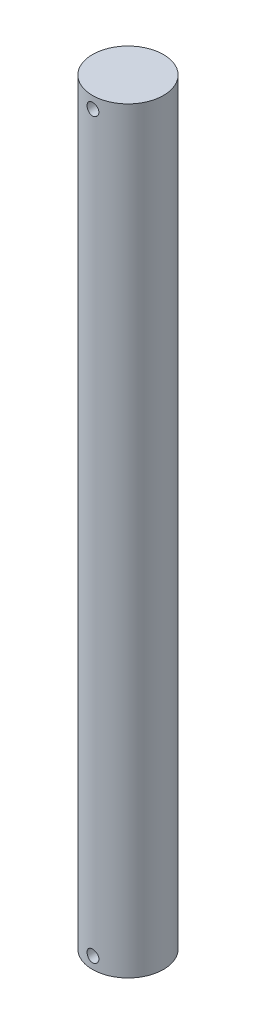
ISO-10303-21;
HEADER;
FILE_DESCRIPTION(('STEP AP214'),'2;1');
FILE_NAME('part.step','',(''),(''),'','','');
FILE_SCHEMA(('AUTOMOTIVE_DESIGN { 1 0 10303 214 1 1 1 1 }'));
ENDSEC;
DATA;
#1=APPLICATION_CONTEXT('core data for automotive mechanical design processes');
#2=APPLICATION_PROTOCOL_DEFINITION('international standard','automotive_design',2000,#1);
#3=PRODUCT_CONTEXT('',#1,'mechanical');
#4=PRODUCT('Part','Part','',(#3));
#5=PRODUCT_RELATED_PRODUCT_CATEGORY('part','',(#4));
#6=PRODUCT_DEFINITION_FORMATION('','',#4);
#7=PRODUCT_DEFINITION_CONTEXT('part definition',#1,'design');
#8=PRODUCT_DEFINITION('design','',#6,#7);
#9=PRODUCT_DEFINITION_SHAPE('','',#8);
#10=(LENGTH_UNIT() NAMED_UNIT(*) SI_UNIT(.MILLI.,.METRE.));
#11=(NAMED_UNIT(*) PLANE_ANGLE_UNIT() SI_UNIT($,.RADIAN.));
#12=(NAMED_UNIT(*) SI_UNIT($,.STERADIAN.) SOLID_ANGLE_UNIT());
#13=UNCERTAINTY_MEASURE_WITH_UNIT(LENGTH_MEASURE(1.E-05),#10,'distance_accuracy_value','');
#14=(GEOMETRIC_REPRESENTATION_CONTEXT(3) GLOBAL_UNCERTAINTY_ASSIGNED_CONTEXT((#13)) GLOBAL_UNIT_ASSIGNED_CONTEXT((#10,
#11,#12)) REPRESENTATION_CONTEXT('',''));
#15=CARTESIAN_POINT('',(0.,0.,0.));
#16=DIRECTION('',(0.,0.,1.));
#17=DIRECTION('',(1.,0.,0.));
#18=AXIS2_PLACEMENT_3D('',#15,#16,#17);
#19=CARTESIAN_POINT('',(0.,640.,0.));
#20=DIRECTION('',(0.,-1.,0.));
#21=DIRECTION('',(0.,0.,-1.));
#22=AXIS2_PLACEMENT_3D('',#19,#20,#21);
#23=CYLINDRICAL_SURFACE('',#22,30.);
#24=CARTESIAN_POINT('',(0.,15.,-30.));
#25=CARTESIAN_POINT('',(-0.139438730306518,15.000002148603,-30.0000009341092));
#26=CARTESIAN_POINT('',(-0.27884837499536,14.9941652443515,-29.9990260400444));
#27=CARTESIAN_POINT('',(-0.556708896140972,14.9708658164974,-29.9951557115238));
#28=CARTESIAN_POINT('',(-0.695159577308831,14.9534009913958,-29.9922598968632));
#29=CARTESIAN_POINT('',(-0.970150520344154,14.9069611871019,-29.9846251699259));
#30=CARTESIAN_POINT('',(-1.10668952072418,14.8779789470685,-29.979885095025));
#31=CARTESIAN_POINT('',(-1.37685247096437,14.8087139445941,-29.9686930297133));
#32=CARTESIAN_POINT('',(-1.51047533178691,14.7684270356836,-29.9622404112013));
#33=CARTESIAN_POINT('',(-1.77365528085701,14.6769149986391,-29.9478128865368));
#34=CARTESIAN_POINT('',(-1.90321704710935,14.6257030293222,-29.9398398129292));
#35=CARTESIAN_POINT('',(-2.15759207174616,14.512668231626,-29.9225843720656));
#36=CARTESIAN_POINT('',(-2.28240355940393,14.4508414928787,-29.9133015225275));
#37=CARTESIAN_POINT('',(-2.52631223217171,14.3170688876175,-29.8936901460056));
#38=CARTESIAN_POINT('',(-2.64541222152925,14.2451280566014,-29.8833621400859));
#39=CARTESIAN_POINT('',(-2.87720075943645,14.0915826775771,-29.8619368035706));
#40=CARTESIAN_POINT('',(-2.98988690101178,14.0099745365835,-29.8508391875783));
#41=CARTESIAN_POINT('',(-3.20893550320275,13.8369740483396,-29.8280901061561));
#42=CARTESIAN_POINT('',(-3.3152386019937,13.7455070296461,-29.8164348485225));
#43=CARTESIAN_POINT('',(-3.51981905081325,13.5539441062719,-29.792977049997));
#44=CARTESIAN_POINT('',(-3.6180934149484,13.4538450195095,-29.7811744561748));
#45=CARTESIAN_POINT('',(-3.80586900468401,13.2457655657288,-29.757760553176));
#46=CARTESIAN_POINT('',(-3.89537288715651,13.137787602886,-29.7461491869625));
#47=CARTESIAN_POINT('',(-4.06505128766863,12.9146207574097,-29.7234367117224));
#48=CARTESIAN_POINT('',(-4.14522235269035,12.7994292299429,-29.7123357924676));
#49=CARTESIAN_POINT('',(-4.29606801839333,12.5619714746938,-29.6909016370194));
#50=CARTESIAN_POINT('',(-4.36668480543058,12.4396680682227,-29.6805732300208));
#51=CARTESIAN_POINT('',(-4.49737903615683,12.1894109133508,-29.6610510502017));
#52=CARTESIAN_POINT('',(-4.55745254274493,12.0614550764348,-29.6518577016161));
#53=CARTESIAN_POINT('',(-4.66655756396113,11.800880688985,-29.6348831234285));
#54=CARTESIAN_POINT('',(-4.7155937427807,11.6682641354876,-29.6271012976113));
#55=CARTESIAN_POINT('',(-4.80229722760728,11.399267690265,-29.6131700678879));
#56=CARTESIAN_POINT('',(-4.83996038282925,11.2628864443209,-29.6070212600786));
#57=CARTESIAN_POINT('',(-4.93477467758659,10.8521985241443,-29.5914227981395));
#58=CARTESIAN_POINT('',(-4.97488357358493,10.5736311346302,-29.5846386003063));
#59=CARTESIAN_POINT('',(-5.00784793424048,10.0137968416156,-29.5790755483693));
#60=CARTESIAN_POINT('',(-5.00070674304215,9.73253013056755,-29.5802961277241));
#61=CARTESIAN_POINT('',(-4.93978637434362,9.17815552142718,-29.590529429811));
#62=CARTESIAN_POINT('',(-4.88648873937526,8.90499340626046,-29.5994616948564));
#63=CARTESIAN_POINT('',(-4.73550730524632,8.37155435088744,-29.6239896757343));
#64=CARTESIAN_POINT('',(-4.63782198375658,8.11127785294845,-29.6395856201047));
#65=CARTESIAN_POINT('',(-4.40035421574883,7.60954316628105,-29.6757696483376));
#66=CARTESIAN_POINT('',(-4.26037175365461,7.36818140582108,-29.6963813586744));
#67=CARTESIAN_POINT('',(-3.94242410922568,6.91219098092208,-29.7402583517709));
#68=CARTESIAN_POINT('',(-3.76445586128014,6.69756447634457,-29.7635238486315));
#69=CARTESIAN_POINT('',(-3.37296440409906,6.29834788785884,-29.8104405621052));
#70=CARTESIAN_POINT('',(-3.15902792232791,6.1141629788504,-29.8340929858411));
#71=CARTESIAN_POINT('',(-2.70307050338167,5.78424445873864,-29.8788520267263));
#72=CARTESIAN_POINT('',(-2.46104938526711,5.63851109538495,-29.8999586274719));
#73=CARTESIAN_POINT('',(-1.95541183087794,5.38959554997958,-29.9372778581815));
#74=CARTESIAN_POINT('',(-1.6917774507324,5.2864491623958,-29.9534863682324));
#75=CARTESIAN_POINT('',(-1.15059669160235,5.1260115684498,-29.9791500601698));
#76=CARTESIAN_POINT('',(-0.873051478491172,5.06871652607123,-29.988605806999));
#77=CARTESIAN_POINT('',(-0.315419802472563,5.00215728305926,-29.999622596864));
#78=CARTESIAN_POINT('',(-0.0354014741699759,4.99233685528185,-30.0012750602153));
#79=CARTESIAN_POINT('',(0.522279545647737,5.01952268996312,-29.9967494884638));
#80=CARTESIAN_POINT('',(0.799942327386603,5.05652715067645,-29.9905717546544));
#81=CARTESIAN_POINT('',(1.3433123514886,5.17584969428862,-29.971136538593));
#82=CARTESIAN_POINT('',(1.60908173821583,5.25789240039748,-29.9579220953842));
#83=CARTESIAN_POINT('',(2.12309376827574,5.46466905278275,-29.9258892897492));
#84=CARTESIAN_POINT('',(2.37133542643381,5.5894053964243,-29.9070706126377));
#85=CARTESIAN_POINT('',(2.84566138437114,5.87930218769945,-29.8656903236297));
#86=CARTESIAN_POINT('',(3.07153052223238,6.04481008114228,-29.8430971086773));
#87=CARTESIAN_POINT('',(3.49248715064582,6.41107486197913,-29.7967693569018));
#88=CARTESIAN_POINT('',(3.68757240338597,6.61183430971993,-29.7730347372687));
#89=CARTESIAN_POINT('',(4.04348563611056,7.04539422403469,-29.7268034705286));
#90=CARTESIAN_POINT('',(4.20393781021313,7.27850506055188,-29.7043221945332));
#91=CARTESIAN_POINT('',(4.48340433261341,7.76870920865032,-29.6634307237625));
#92=CARTESIAN_POINT('',(4.60241999444133,8.02580175968778,-29.6450203999454));
#93=CARTESIAN_POINT('',(4.79507773356379,8.55556730727753,-29.6144685973239));
#94=CARTESIAN_POINT('',(4.86890685306042,8.82817090119132,-29.602301310812));
#95=CARTESIAN_POINT('',(4.96966691993878,9.38228554337532,-29.5855561119601));
#96=CARTESIAN_POINT('',(4.99660194454599,9.66379581508378,-29.580977539818));
#97=CARTESIAN_POINT('',(5.0012321244509,10.0844097834175,-29.5801885462874));
#98=CARTESIAN_POINT('',(4.99693975789018,10.2235369220243,-29.5809172344068));
#99=CARTESIAN_POINT('',(4.97678436801742,10.5009125844857,-29.5843160283654));
#100=CARTESIAN_POINT('',(4.96092569221815,10.6391614187853,-29.5869854047428));
#101=CARTESIAN_POINT('',(4.91774640529922,10.9138477892768,-29.5941926651669));
#102=CARTESIAN_POINT('',(4.89042170080803,11.0502846606349,-29.5987312164982));
#103=CARTESIAN_POINT('',(4.82453301754958,11.3202964548754,-29.6095423170401));
#104=CARTESIAN_POINT('',(4.78597308458851,11.4538723894262,-29.615814242021));
#105=CARTESIAN_POINT('',(4.6979342864003,11.7171686051217,-29.6299071307843));
#106=CARTESIAN_POINT('',(4.64846435664851,11.846891943521,-29.6377268263817));
#107=CARTESIAN_POINT('',(4.53896986674982,12.1016587264378,-29.6546930297384));
#108=CARTESIAN_POINT('',(4.47894908739059,12.226703827951,-29.6638390620139));
#109=CARTESIAN_POINT('',(4.34874498523013,12.4713614507995,-29.6832065043881));
#110=CARTESIAN_POINT('',(4.27855767862003,12.5909718182554,-29.6934283356131));
#111=CARTESIAN_POINT('',(4.12855715704193,12.8238615256318,-29.7146554589665));
#112=CARTESIAN_POINT('',(4.04874732556529,12.9371430705211,-29.7256604751555));
#113=CARTESIAN_POINT('',(3.87899685367998,13.1580086987021,-29.7482907408856));
#114=CARTESIAN_POINT('',(3.78894418512202,13.2655060901041,-29.7599219326499));
#115=CARTESIAN_POINT('',(3.60017574898997,13.472513396479,-29.783347263822));
#116=CARTESIAN_POINT('',(3.50146308651917,13.5720261500963,-29.7951413435574));
#117=CARTESIAN_POINT('',(3.29596225179814,13.7624819299774,-29.8185735949796));
#118=CARTESIAN_POINT('',(3.18916929766622,13.8534198090311,-29.8302116694714));
#119=CARTESIAN_POINT('',(2.9683310868055,14.0259957161049,-29.8529952569281));
#120=CARTESIAN_POINT('',(2.85428852146921,14.1076371643346,-29.8641409501131));
#121=CARTESIAN_POINT('',(2.6188382428721,14.2616450304106,-29.8857116363867));
#122=CARTESIAN_POINT('',(2.49738284629917,14.3339393989323,-29.896130775176));
#123=CARTESIAN_POINT('',(2.24876507402075,14.4679967471859,-29.9158586577262));
#124=CARTESIAN_POINT('',(2.12160481976541,14.5297636014166,-29.925167809621));
#125=CARTESIAN_POINT('',(1.86251821435405,14.6423007062681,-29.9424090895346));
#126=CARTESIAN_POINT('',(1.7305952461548,14.6930785897747,-29.950342172599));
#127=CARTESIAN_POINT('',(1.46288984328885,14.7832948188954,-29.9646113279921));
#128=CARTESIAN_POINT('',(1.32710824358209,14.8227355974939,-29.9709477429356));
#129=CARTESIAN_POINT('',(0.99549214137986,14.9039783011701,-29.9841083147641));
#130=CARTESIAN_POINT('',(0.798161887183512,14.9399436570318,-29.9900398634941));
#131=CARTESIAN_POINT('',(0.400534394814459,14.9879527577987,-29.9979850016837));
#132=CARTESIAN_POINT('',(0.20023720778345,14.9999969145569,-29.9999986585978));
#133=CARTESIAN_POINT('',(0.,15.,-30.));
#134=B_SPLINE_CURVE_WITH_KNOTS('',3,(#24,#25,#26,#27,#28,#29,#30,#31,#32,#33,#34,#35,#36,#37,
#38,#39,#40,#41,#42,#43,#44,#45,#46,#47,#48,#49,#50,#51,#52,#53,#54,#55,#56,#57,#58,#59,#60,#61,
#62,#63,#64,#65,#66,#67,#68,#69,#70,#71,#72,#73,#74,#75,#76,#77,#78,#79,#80,#81,#82,#83,#84,#85,
#86,#87,#88,#89,#90,#91,#92,#93,#94,#95,#96,#97,#98,#99,#100,#101,#102,#103,#104,#105,#106,#107,
#108,#109,#110,#111,#112,#113,#114,#115,#116,#117,#118,#119,#120,#121,#122,#123,#124,#125,#126,
#127,#128,#129,#130,#131,#132,#133),.UNSPECIFIED.,.T.,.F.,(4,2,2,2,2,2,2,2,2,2,2,2,2,2,2,2,2,2,
2,2,2,2,2,2,2,2,2,2,2,2,2,2,2,2,2,2,2,2,2,2,2,2,2,2,2,2,2,2,2,2,2,2,2,2,4),(0.,
0.418140677636318,0.836364141924731,1.25485168316257,1.67349292366114,2.09163274536574,
2.50992693714591,2.92801360569262,3.3462561521736,3.767924736377,4.18974943231197,
4.61144594582073,5.03329798883921,5.45759827861687,5.88205667621393,6.30633536657102,
6.73076871826474,7.57090272280959,8.41097726715885,9.24239161594929,10.0738344812487,
10.9092723133923,11.7447775943526,12.5906365789677,13.4365010134581,14.2830749590592,
15.1295780711641,15.9661388505691,16.8026674414583,17.6341373208694,18.4656538972625,
19.3045176932816,20.1434424418268,20.9910576208935,21.83864592826,22.6827016275766,
23.5266839364735,23.9438629667131,24.3608852695982,24.77805657625,25.1950778447662,
25.6117588257789,26.0282907967259,26.4449864317718,26.8615359724481,27.2831832626947,
27.7046799813852,28.1264281209232,28.5480205921467,28.9726903230862,29.3972034214198,
29.8214207018257,30.2455468755532,30.8460167962321,31.4464763784911),.UNSPECIFIED.);
#135=CARTESIAN_POINT('',(0.,15.,-30.));
#136=VERTEX_POINT('',#135);
#137=EDGE_CURVE('E10',#136,#136,#134,.T.);
#138=ORIENTED_EDGE('',*,*,#137,.T.);
#139=EDGE_LOOP('',(#138));
#140=FACE_BOUND('',#139,.T.);
#141=CARTESIAN_POINT('',(5.,9.99999999999999,29.5803989154981));
#142=CARTESIAN_POINT('',(5.00000215212787,9.86057639626243,29.5803979326159));
#143=CARTESIAN_POINT('',(4.99416650120511,9.72118188035827,29.5813865662228));
#144=CARTESIAN_POINT('',(4.97087220441201,9.44335202662435,29.5853101778166));
#145=CARTESIAN_POINT('',(4.95341125568433,9.30491688432795,29.5882455414312));
#146=CARTESIAN_POINT('',(4.90698205316678,9.02995735248328,29.595980767529));
#147=CARTESIAN_POINT('',(4.87800651661557,8.89343422893418,29.6007818099767));
#148=CARTESIAN_POINT('',(4.80875805511328,8.62330337377943,29.6121103008977));
#149=CARTESIAN_POINT('',(4.76848098179349,8.48969673215014,29.618638383252));
#150=CARTESIAN_POINT('',(4.67699269476572,8.22655128993244,29.6332225751521));
#151=CARTESIAN_POINT('',(4.62579483693731,8.09700774026884,29.6412768169069));
#152=CARTESIAN_POINT('',(4.51279168660919,7.8426675985294,29.6586914491271));
#153=CARTESIAN_POINT('',(4.45098248431024,7.71787277692327,29.6680523207879));
#154=CARTESIAN_POINT('',(4.3172476442902,7.47399448609597,29.6878078821124));
#155=CARTESIAN_POINT('',(4.24532702372849,7.35490822341934,29.6982020583187));
#156=CARTESIAN_POINT('',(4.09182393832117,7.1231434031446,29.7197406344104));
#157=CARTESIAN_POINT('',(4.01023788081428,7.01046725137721,29.7308853125904));
#158=CARTESIAN_POINT('',(3.83725956163011,6.79140518707714,29.7537075193766));
#159=CARTESIAN_POINT('',(3.74579019488665,6.68508053864487,29.765388757594));
#160=CARTESIAN_POINT('',(3.55421801378063,6.48045677901976,29.7888712088753));
#161=CARTESIAN_POINT('',(3.45411201537784,6.38216065390049,29.8006724647591));
#162=CARTESIAN_POINT('',(3.2460144077782,6.19434246688342,29.8240565154478));
#163=CARTESIAN_POINT('',(3.13802523187875,6.1048177173451,29.8356393762872));
#164=CARTESIAN_POINT('',(2.91483167477465,5.9350991630834,29.8582708932577));
#165=CARTESIAN_POINT('',(2.79962464827634,5.85490881049046,29.8693193508737));
#166=CARTESIAN_POINT('',(2.56215441101307,5.7040411409087,29.8906281533999));
#167=CARTESIAN_POINT('',(2.43985519869266,5.6334197920083,29.9008837226048));
#168=CARTESIAN_POINT('',(2.18960603977585,5.50271600286675,29.9202504077895));
#169=CARTESIAN_POINT('',(2.06165400465136,5.44263749931004,29.9293610959132));
#170=CARTESIAN_POINT('',(1.80108735309577,5.33352223665116,29.9461700436224));
#171=CARTESIAN_POINT('',(1.6684747236184,5.28448083656165,29.9538688966168));
#172=CARTESIAN_POINT('',(1.39948700260422,5.19776675687594,29.9676431912186));
#173=CARTESIAN_POINT('',(1.26311055653696,5.16009822997123,29.9737180397443));
#174=CARTESIAN_POINT('',(0.852446509264918,5.0652690310551,29.9891228124451));
#175=CARTESIAN_POINT('',(0.573900376996178,5.02514865906307,29.9958138795881));
#176=CARTESIAN_POINT('',(0.0141079703099225,4.99215400160735,30.0013047692693));
#177=CARTESIAN_POINT('',(-0.267138119279395,4.99927650479383,30.000105128181));
#178=CARTESIAN_POINT('',(-0.821593120474354,5.06016652948971,29.9900163282399));
#179=CARTESIAN_POINT('',(-1.09485404654849,5.11347135228088,29.9812034486287));
#180=CARTESIAN_POINT('',(-1.6284869741672,5.26450112299916,29.9569598006588));
#181=CARTESIAN_POINT('',(-1.88885858289245,5.36222742380764,29.9415288307432));
#182=CARTESIAN_POINT('',(-2.39071148226925,5.59978155726274,29.9056539094833));
#183=CARTESIAN_POINT('',(-2.63210082802069,5.73980009832084,29.885187330251));
#184=CARTESIAN_POINT('',(-3.08813127772834,6.05782557110812,29.8415147777179));
#185=CARTESIAN_POINT('',(-3.30277021457954,6.23583557743863,29.8183085827714));
#186=CARTESIAN_POINT('',(-3.70194248743282,6.62735763346403,29.77140536021));
#187=CARTESIAN_POINT('',(-3.88607898857917,6.84127419522207,29.7477057934308));
#188=CARTESIAN_POINT('',(-4.21590919282353,7.29717417501147,29.7027591968862));
#189=CARTESIAN_POINT('',(-4.36160254131311,7.5391578519107,29.6815121897447));
#190=CARTESIAN_POINT('',(-4.61048886472354,8.04478328521151,29.6438750909177));
#191=CARTESIAN_POINT('',(-4.71363405349992,8.30844899658137,29.6274904659697));
#192=CARTESIAN_POINT('',(-4.87405974268971,8.84969814421793,29.6015237738799));
#193=CARTESIAN_POINT('',(-4.93134428151734,9.12728035273259,29.5919411077771));
#194=CARTESIAN_POINT('',(-4.99786376977689,9.68493231245493,29.5807791884317));
#195=CARTESIAN_POINT('',(-5.0076644169312,9.96493275953604,29.5791057152116));
#196=CARTESIAN_POINT('',(-4.98044540425865,10.5225733432498,29.583700695609));
#197=CARTESIAN_POINT('',(-4.94342755284268,10.8002135706313,29.5899688424735));
#198=CARTESIAN_POINT('',(-4.82410467423498,11.3434555187759,29.6096537492629));
#199=CARTESIAN_POINT('',(-4.74208759766018,11.6091222811975,29.6230250389774));
#200=CARTESIAN_POINT('',(-4.53539636401618,12.1229403311174,29.6553714594995));
#201=CARTESIAN_POINT('',(-4.4107196551057,12.3710905697294,29.6743469255321));
#202=CARTESIAN_POINT('',(-4.12091340811815,12.8453491942341,29.7159825702484));
#203=CARTESIAN_POINT('',(-3.95542135942323,13.0712331658314,29.7386751206295));
#204=CARTESIAN_POINT('',(-3.5891787002952,13.4922270450693,29.7850933249741));
#205=CARTESIAN_POINT('',(-3.38842560992089,13.6873347863563,29.8088190515135));
#206=CARTESIAN_POINT('',(-2.95485701247824,14.0433038621095,29.8549284748932));
#207=CARTESIAN_POINT('',(-2.72172977623535,14.2037879400263,29.8772956488783));
#208=CARTESIAN_POINT('',(-2.23148362654147,14.4833103665618,29.9179021266779));
#209=CARTESIAN_POINT('',(-1.97436548948827,14.6023500558218,29.9361415640095));
#210=CARTESIAN_POINT('',(-1.44461025477472,14.7950222363159,29.9663676167788));
#211=CARTESIAN_POINT('',(-1.17204638474136,14.8688521307716,29.9783813800026));
#212=CARTESIAN_POINT('',(-0.618016213936816,14.9696272189533,29.9949099748744));
#213=CARTESIAN_POINT('',(-0.336550647617407,14.9965762704526,29.999425423549));
#214=CARTESIAN_POINT('',(0.084051323623507,15.001239001663,30.0002084581204));
#215=CARTESIAN_POINT('',(0.223209655690205,14.9969552500374,29.999491569583));
#216=CARTESIAN_POINT('',(0.500648669793316,14.9768117991662,29.9961418479859));
#217=CARTESIAN_POINT('',(0.638929661828227,14.9609564482256,29.9935097346187));
#218=CARTESIAN_POINT('',(0.913680965571359,14.9177783012345,29.9863985702464));
#219=CARTESIAN_POINT('',(1.05015061623528,14.8904514312823,29.9819188631118));
#220=CARTESIAN_POINT('',(1.32022824391753,14.824552637904,29.9712403869649));
#221=CARTESIAN_POINT('',(1.45383723354143,14.7859847666036,29.9650422374513));
#222=CARTESIAN_POINT('',(1.71720548972901,14.6979220262972,29.95110323313));
#223=CARTESIAN_POINT('',(1.84696762706274,14.6484355508395,29.9433635637899));
#224=CARTESIAN_POINT('',(2.10180951631926,14.5389013361162,29.9265550855046));
#225=CARTESIAN_POINT('',(2.22689092747563,14.4788573831337,29.9174867532583));
#226=CARTESIAN_POINT('',(2.47161697545382,14.3486011123381,29.8982638774694));
#227=CARTESIAN_POINT('',(2.59125946645759,14.2783848261974,29.8881089104256));
#228=CARTESIAN_POINT('',(2.8242079991635,14.1283215520988,29.8669972490416));
#229=CARTESIAN_POINT('',(2.93751624967617,14.048477952327,29.8560408372885));
#230=CARTESIAN_POINT('',(3.15838432816091,13.8786904463363,29.8334892153085));
#231=CARTESIAN_POINT('',(3.26586029407928,13.788638226688,29.8218879813952));
#232=CARTESIAN_POINT('',(3.47282432265109,13.5998751311197,29.7984955265668));
#233=CARTESIAN_POINT('',(3.57231522401815,13.5011673586216,29.7867043749739));
#234=CARTESIAN_POINT('',(3.76272784850023,13.2956806705058,29.7632506471209));
#235=CARTESIAN_POINT('',(3.85364439911056,13.1888969521477,29.7515881521716));
#236=CARTESIAN_POINT('',(4.02617893630593,12.9680815442526,29.7287311492829));
#237=CARTESIAN_POINT('',(4.10780033921658,12.8540525418,29.7175364703668));
#238=CARTESIAN_POINT('',(4.26178317336446,12.6186134362886,29.6958464681928));
#239=CARTESIAN_POINT('',(4.33407091155741,12.4971545774759,29.6853569910252));
#240=CARTESIAN_POINT('',(4.4681147095236,12.2485306516489,29.6654772768531));
#241=CARTESIAN_POINT('',(4.5298746441277,12.1213677059251,29.6560866358151));
#242=CARTESIAN_POINT('',(4.6423978626488,11.8622759875397,29.6386805621146));
#243=CARTESIAN_POINT('',(4.69316880713277,11.7303506101737,29.6306641722598));
#244=CARTESIAN_POINT('',(4.7833713057041,11.4626397573099,29.6162360630624));
#245=CARTESIAN_POINT('',(4.82280529766023,11.326855118609,29.6098239987682));
#246=CARTESIAN_POINT('',(4.90401989375999,10.9952779254209,29.596502515164));
#247=CARTESIAN_POINT('',(4.93996956730933,10.7979905965017,29.5904931161671));
#248=CARTESIAN_POINT('',(4.98795785830044,10.4004488187018,29.5824420579954));
#249=CARTESIAN_POINT('',(4.99999690982024,10.2001944237523,29.5804003267909));
#250=CARTESIAN_POINT('',(5.,9.99999999999999,29.5803989154981));
#251=B_SPLINE_CURVE_WITH_KNOTS('',3,(#141,#142,#143,#144,#145,#146,#147,#148,#149,#150,#151,
#152,#153,#154,#155,#156,#157,#158,#159,#160,#161,#162,#163,#164,#165,#166,#167,#168,#169,#170,
#171,#172,#173,#174,#175,#176,#177,#178,#179,#180,#181,#182,#183,#184,#185,#186,#187,#188,#189,
#190,#191,#192,#193,#194,#195,#196,#197,#198,#199,#200,#201,#202,#203,#204,#205,#206,#207,#208,
#209,#210,#211,#212,#213,#214,#215,#216,#217,#218,#219,#220,#221,#222,#223,#224,#225,#226,#227,
#228,#229,#230,#231,#232,#233,#234,#235,#236,#237,#238,#239,#240,#241,#242,#243,#244,#245,#246,
#247,#248,#249,#250),.UNSPECIFIED.,.T.,.F.,(4,2,2,2,2,2,2,2,2,2,2,2,2,2,2,2,2,2,2,2,2,2,2,2,2,2,
2,2,2,2,2,2,2,2,2,2,2,2,2,2,2,2,2,2,2,2,2,2,2,2,2,2,2,2,4),(0.,0.418095242549752,
0.836273330312913,1.25471632992755,1.67331312559436,2.09140089204124,2.50964303678586,
2.92767838265871,3.34586960348905,3.76759791918756,4.18948238202711,4.61123716813954,
5.03314743913425,5.45742771408346,5.88186607917447,6.30612563749769,6.730539923145,
7.57061257037404,8.41062811397658,9.24232364421611,10.0740445059134,10.9095733037112,
11.745169745458,12.5909036901652,13.4366454358431,14.2833344708948,15.1299489396843,
15.966452069331,16.8029228892023,17.6341025136326,18.4653318667942,19.3042280761768,
20.1431833095365,20.9908634816304,21.8385162304567,22.6824409092757,23.5262961391698,
23.9435677338949,24.3606826095272,24.7779457414127,25.1950586450546,25.6118520083923,
26.0284961987167,26.4453033659293,26.8619642700311,27.2835543146456,27.7049938127195,
28.1266859407461,28.5482225769884,28.9729067446496,29.3974342652835,29.8216648822648,
30.2458042054463,30.8461462814325,31.4464774585936),.UNSPECIFIED.);
#252=CARTESIAN_POINT('',(5.,9.99999999999999,29.5803989154981));
#253=VERTEX_POINT('',#252);
#254=EDGE_CURVE('E44',#253,#253,#251,.T.);
#255=ORIENTED_EDGE('',*,*,#254,.T.);
#256=EDGE_LOOP('',(#255));
#257=FACE_BOUND('',#256,.T.);
#258=CARTESIAN_POINT('',(0.,635.,-30.));
#259=CARTESIAN_POINT('',(-0.139438730306515,635.000002148603,-30.0000009341092));
#260=CARTESIAN_POINT('',(-0.278848374995354,634.994165244352,-29.9990260400444));
#261=CARTESIAN_POINT('',(-0.556708896140966,634.970865816498,-29.9951557115238));
#262=CARTESIAN_POINT('',(-0.695159577308828,634.953400991396,-29.9922598968632));
#263=CARTESIAN_POINT('',(-0.970150520344144,634.906961187102,-29.9846251699259));
#264=CARTESIAN_POINT('',(-1.10668952072416,634.877978947068,-29.979885095025));
#265=CARTESIAN_POINT('',(-1.37685247096436,634.808713944594,-29.9686930297133));
#266=CARTESIAN_POINT('',(-1.51047533178691,634.768427035684,-29.9622404112013));
#267=CARTESIAN_POINT('',(-1.77365528085701,634.676914998639,-29.9478128865369));
#268=CARTESIAN_POINT('',(-1.90321704710932,634.625703029322,-29.9398398129292));
#269=CARTESIAN_POINT('',(-2.15759207174612,634.512668231626,-29.9225843720657));
#270=CARTESIAN_POINT('',(-2.28240355940389,634.450841492879,-29.9133015225275));
#271=CARTESIAN_POINT('',(-2.52631223217169,634.317068887618,-29.8936901460056));
#272=CARTESIAN_POINT('',(-2.64541222152922,634.245128056602,-29.8833621400859));
#273=CARTESIAN_POINT('',(-2.87720075943642,634.091582677577,-29.8619368035706));
#274=CARTESIAN_POINT('',(-2.98988690101175,634.009974536584,-29.8508391875783));
#275=CARTESIAN_POINT('',(-3.20893550320274,633.83697404834,-29.8280901061561));
#276=CARTESIAN_POINT('',(-3.31523860199372,633.745507029646,-29.8164348485225));
#277=CARTESIAN_POINT('',(-3.51981905081328,633.553944106272,-29.792977049997));
#278=CARTESIAN_POINT('',(-3.61809341494841,633.45384501951,-29.7811744561748));
#279=CARTESIAN_POINT('',(-3.805869004684,633.245765565729,-29.757760553176));
#280=CARTESIAN_POINT('',(-3.89537288715651,633.137787602886,-29.7461491869625));
#281=CARTESIAN_POINT('',(-4.06505128766864,632.91462075741,-29.7234367117224));
#282=CARTESIAN_POINT('',(-4.14522235269037,632.799429229943,-29.7123357924676));
#283=CARTESIAN_POINT('',(-4.29606801839331,632.561971474694,-29.6909016370194));
#284=CARTESIAN_POINT('',(-4.36668480543054,632.439668068223,-29.6805732300208));
#285=CARTESIAN_POINT('',(-4.49737903615678,632.189410913351,-29.6610510502017));
#286=CARTESIAN_POINT('',(-4.55745254274489,632.061455076435,-29.6518577016161));
#287=CARTESIAN_POINT('',(-4.66655756396111,631.800880688985,-29.6348831234285));
#288=CARTESIAN_POINT('',(-4.71559374278069,631.668264135488,-29.6271012976113));
#289=CARTESIAN_POINT('',(-4.80229722760727,631.399267690265,-29.6131700678879));
#290=CARTESIAN_POINT('',(-4.83996038282923,631.262886444321,-29.6070212600786));
#291=CARTESIAN_POINT('',(-4.93477467758657,630.852198524144,-29.5914227981395));
#292=CARTESIAN_POINT('',(-4.97488357358493,630.57363113463,-29.5846386003063));
#293=CARTESIAN_POINT('',(-5.00784793424048,630.013796841616,-29.5790755483693));
#294=CARTESIAN_POINT('',(-5.00070674304216,629.732530130568,-29.5802961277241));
#295=CARTESIAN_POINT('',(-4.93978637434363,629.178155521427,-29.590529429811));
#296=CARTESIAN_POINT('',(-4.88648873937526,628.90499340626,-29.5994616948564));
#297=CARTESIAN_POINT('',(-4.73550730524632,628.371554350887,-29.6239896757343));
#298=CARTESIAN_POINT('',(-4.63782198375658,628.111277852949,-29.6395856201047));
#299=CARTESIAN_POINT('',(-4.40035421574882,627.609543166281,-29.6757696483376));
#300=CARTESIAN_POINT('',(-4.26037175365457,627.368181405821,-29.6963813586745));
#301=CARTESIAN_POINT('',(-3.94242410922562,626.912190980922,-29.7402583517709));
#302=CARTESIAN_POINT('',(-3.7644558612801,626.697564476344,-29.7635238486315));
#303=CARTESIAN_POINT('',(-3.37296440409904,626.298347887859,-29.8104405621052));
#304=CARTESIAN_POINT('',(-3.1590279223279,626.11416297885,-29.8340929858412));
#305=CARTESIAN_POINT('',(-2.70307050338166,625.784244458739,-29.8788520267263));
#306=CARTESIAN_POINT('',(-2.46104938526712,625.638511095385,-29.8999586274719));
#307=CARTESIAN_POINT('',(-1.95541183087797,625.38959554998,-29.9372778581815));
#308=CARTESIAN_POINT('',(-1.69177745073244,625.286449162396,-29.9534863682324));
#309=CARTESIAN_POINT('',(-1.15059669160238,625.12601156845,-29.9791500601698));
#310=CARTESIAN_POINT('',(-0.873051478491197,625.068716526071,-29.988605806999));
#311=CARTESIAN_POINT('',(-0.31541980247258,625.002157283059,-29.999622596864));
#312=CARTESIAN_POINT('',(-0.0354014741699928,624.992336855282,-30.0012750602153));
#313=CARTESIAN_POINT('',(0.52227954564772,625.019522689963,-29.9967494884638));
#314=CARTESIAN_POINT('',(0.799942327386586,625.056527150677,-29.9905717546544));
#315=CARTESIAN_POINT('',(1.3433123514886,625.175849694289,-29.971136538593));
#316=CARTESIAN_POINT('',(1.60908173821583,625.257892400398,-29.9579220953842));
#317=CARTESIAN_POINT('',(2.12309376827575,625.464669052783,-29.9258892897492));
#318=CARTESIAN_POINT('',(2.37133542643381,625.589405396424,-29.9070706126377));
#319=CARTESIAN_POINT('',(2.84566138437112,625.879302187699,-29.8656903236297));
#320=CARTESIAN_POINT('',(3.07153052223235,626.044810081142,-29.8430971086773));
#321=CARTESIAN_POINT('',(3.4924871506458,626.411074861979,-29.7967693569018));
#322=CARTESIAN_POINT('',(3.68757240338598,626.61183430972,-29.7730347372687));
#323=CARTESIAN_POINT('',(4.04348563611059,627.045394224035,-29.7268034705286));
#324=CARTESIAN_POINT('',(4.20393781021316,627.278505060552,-29.7043221945332));
#325=CARTESIAN_POINT('',(4.48340433261343,627.76870920865,-29.6634307237625));
#326=CARTESIAN_POINT('',(4.60241999444135,628.025801759688,-29.6450203999454));
#327=CARTESIAN_POINT('',(4.79507773356381,628.555567307278,-29.6144685973239));
#328=CARTESIAN_POINT('',(4.86890685306044,628.828170901191,-29.602301310812));
#329=CARTESIAN_POINT('',(4.96966691993878,629.382285543375,-29.5855561119601));
#330=CARTESIAN_POINT('',(4.99660194454599,629.663795815084,-29.580977539818));
#331=CARTESIAN_POINT('',(5.00123212445091,630.084409783418,-29.5801885462874));
#332=CARTESIAN_POINT('',(4.99693975789019,630.223536922024,-29.5809172344068));
#333=CARTESIAN_POINT('',(4.97678436801742,630.500912584486,-29.5843160283654));
#334=CARTESIAN_POINT('',(4.96092569221814,630.639161418785,-29.5869854047428));
#335=CARTESIAN_POINT('',(4.91774640529921,630.913847789277,-29.5941926651669));
#336=CARTESIAN_POINT('',(4.89042170080804,631.050284660635,-29.5987312164982));
#337=CARTESIAN_POINT('',(4.8245330175496,631.320296454875,-29.6095423170401));
#338=CARTESIAN_POINT('',(4.78597308458852,631.453872389426,-29.615814242021));
#339=CARTESIAN_POINT('',(4.69793428640031,631.717168605122,-29.6299071307843));
#340=CARTESIAN_POINT('',(4.64846435664851,631.846891943521,-29.6377268263817));
#341=CARTESIAN_POINT('',(4.53896986674981,632.101658726438,-29.6546930297384));
#342=CARTESIAN_POINT('',(4.47894908739058,632.226703827951,-29.6638390620139));
#343=CARTESIAN_POINT('',(4.34874498523012,632.471361450799,-29.6832065043881));
#344=CARTESIAN_POINT('',(4.27855767862004,632.590971818255,-29.6934283356131));
#345=CARTESIAN_POINT('',(4.12855715704196,632.823861525632,-29.7146554589665));
#346=CARTESIAN_POINT('',(4.04874732556531,632.937143070521,-29.7256604751555));
#347=CARTESIAN_POINT('',(3.87899685367999,633.158008698702,-29.7482907408856));
#348=CARTESIAN_POINT('',(3.78894418512201,633.265506090104,-29.7599219326499));
#349=CARTESIAN_POINT('',(3.60017574898994,633.472513396479,-29.783347263822));
#350=CARTESIAN_POINT('',(3.50146308651916,633.572026150096,-29.7951413435574));
#351=CARTESIAN_POINT('',(3.29596225179813,633.762481929977,-29.8185735949796));
#352=CARTESIAN_POINT('',(3.1891692976662,633.853419809031,-29.8302116694714));
#353=CARTESIAN_POINT('',(2.96833108680548,634.025995716105,-29.8529952569281));
#354=CARTESIAN_POINT('',(2.8542885214692,634.107637164335,-29.8641409501131));
#355=CARTESIAN_POINT('',(2.61883824287212,634.261645030411,-29.8857116363867));
#356=CARTESIAN_POINT('',(2.4973828462992,634.333939398932,-29.896130775176));
#357=CARTESIAN_POINT('',(2.24876507402078,634.467996747186,-29.9158586577262));
#358=CARTESIAN_POINT('',(2.12160481976542,634.529763601417,-29.925167809621));
#359=CARTESIAN_POINT('',(1.86251821435406,634.642300706268,-29.9424090895346));
#360=CARTESIAN_POINT('',(1.73059524615482,634.693078589775,-29.950342172599));
#361=CARTESIAN_POINT('',(1.46288984328888,634.783294818895,-29.9646113279921));
#362=CARTESIAN_POINT('',(1.3271082435821,634.822735597494,-29.9709477429356));
#363=CARTESIAN_POINT('',(0.995492141379859,634.90397830117,-29.9841083147641));
#364=CARTESIAN_POINT('',(0.798161887183516,634.939943657032,-29.9900398634941));
#365=CARTESIAN_POINT('',(0.400534394814464,634.987952757799,-29.9979850016837));
#366=CARTESIAN_POINT('',(0.200237207783452,634.999996914557,-29.9999986585978));
#367=CARTESIAN_POINT('',(0.,635.,-30.));
#368=B_SPLINE_CURVE_WITH_KNOTS('',3,(#258,#259,#260,#261,#262,#263,#264,#265,#266,#267,#268,
#269,#270,#271,#272,#273,#274,#275,#276,#277,#278,#279,#280,#281,#282,#283,#284,#285,#286,#287,
#288,#289,#290,#291,#292,#293,#294,#295,#296,#297,#298,#299,#300,#301,#302,#303,#304,#305,#306,
#307,#308,#309,#310,#311,#312,#313,#314,#315,#316,#317,#318,#319,#320,#321,#322,#323,#324,#325,
#326,#327,#328,#329,#330,#331,#332,#333,#334,#335,#336,#337,#338,#339,#340,#341,#342,#343,#344,
#345,#346,#347,#348,#349,#350,#351,#352,#353,#354,#355,#356,#357,#358,#359,#360,#361,#362,#363,
#364,#365,#366,#367),.UNSPECIFIED.,.T.,.F.,(4,2,2,2,2,2,2,2,2,2,2,2,2,2,2,2,2,2,2,2,2,2,2,2,2,2,
2,2,2,2,2,2,2,2,2,2,2,2,2,2,2,2,2,2,2,2,2,2,2,2,2,2,2,2,4),(0.,0.41814067763631,
0.836364141924716,1.25485168316258,1.67349292366113,2.0916327453657,2.50992693714586,
2.92801360569263,3.34625615217358,3.76792473637703,4.18974943231202,4.61144594582078,
5.03329798883918,5.45759827861678,5.88205667621382,6.30633536657095,6.73076871826466,
7.57090272280952,8.41097726715883,9.24239161594933,10.0738344812487,10.9092723133924,
11.7447775943526,12.5906365789677,13.436501013458,14.2830749590591,15.1295780711641,
15.966138850569,16.8026674414583,17.6341373208694,18.4656538972624,19.3045176932816,
20.1434424418268,20.9910576208936,21.83864592826,22.6827016275766,23.5266839364735,
23.943862966713,24.3608852695982,24.7780565762499,25.1950778447661,25.611758825779,
26.0282907967259,26.4449864317718,26.8615359724481,27.2831832626947,27.7046799813852,
28.1264281209232,28.5480205921467,28.9726903230862,29.3972034214197,29.8214207018257,
30.2455468755531,30.8460167962321,31.4464763784911),.UNSPECIFIED.);
#369=CARTESIAN_POINT('',(0.,635.,-30.));
#370=VERTEX_POINT('',#369);
#371=EDGE_CURVE('E48',#370,#370,#368,.T.);
#372=ORIENTED_EDGE('',*,*,#371,.T.);
#373=EDGE_LOOP('',(#372));
#374=FACE_BOUND('',#373,.T.);
#375=CARTESIAN_POINT('',(5.00000000000001,630.,29.5803989154981));
#376=CARTESIAN_POINT('',(5.00000215212787,629.860576396262,29.5803979326159));
#377=CARTESIAN_POINT('',(4.9941665012051,629.721181880358,29.5813865662228));
#378=CARTESIAN_POINT('',(4.970872204412,629.443352026624,29.5853101778166));
#379=CARTESIAN_POINT('',(4.95341125568433,629.304916884328,29.5882455414312));
#380=CARTESIAN_POINT('',(4.90698205316678,629.029957352483,29.595980767529));
#381=CARTESIAN_POINT('',(4.87800651661558,628.893434228934,29.6007818099767));
#382=CARTESIAN_POINT('',(4.80875805511329,628.623303373779,29.6121103008977));
#383=CARTESIAN_POINT('',(4.7684809817935,628.48969673215,29.618638383252));
#384=CARTESIAN_POINT('',(4.67699269476572,628.226551289932,29.6332225751521));
#385=CARTESIAN_POINT('',(4.6257948369373,628.097007740269,29.6412768169069));
#386=CARTESIAN_POINT('',(4.51279168660917,627.842667598529,29.6586914491271));
#387=CARTESIAN_POINT('',(4.45098248431023,627.717872776923,29.6680523207879));
#388=CARTESIAN_POINT('',(4.3172476442902,627.473994486096,29.6878078821124));
#389=CARTESIAN_POINT('',(4.24532702372849,627.354908223419,29.6982020583187));
#390=CARTESIAN_POINT('',(4.09182393832118,627.123143403145,29.7197406344104));
#391=CARTESIAN_POINT('',(4.0102378808143,627.010467251377,29.7308853125904));
#392=CARTESIAN_POINT('',(3.83725956163013,626.791405187077,29.7537075193766));
#393=CARTESIAN_POINT('',(3.74579019488665,626.685080538645,29.765388757594));
#394=CARTESIAN_POINT('',(3.55421801378062,626.48045677902,29.7888712088753));
#395=CARTESIAN_POINT('',(3.45411201537782,626.3821606539,29.8006724647591));
#396=CARTESIAN_POINT('',(3.24601440777816,626.194342466883,29.8240565154478));
#397=CARTESIAN_POINT('',(3.13802523187869,626.104817717345,29.8356393762872));
#398=CARTESIAN_POINT('',(2.91483167477459,625.935099163083,29.8582708932577));
#399=CARTESIAN_POINT('',(2.79962464827631,625.854908810491,29.8693193508737));
#400=CARTESIAN_POINT('',(2.56215441101309,625.704041140909,29.8906281533999));
#401=CARTESIAN_POINT('',(2.43985519869269,625.633419792008,29.9008837226048));
#402=CARTESIAN_POINT('',(2.18960603977588,625.502716002867,29.9202504077895));
#403=CARTESIAN_POINT('',(2.06165400465137,625.44263749931,29.9293610959132));
#404=CARTESIAN_POINT('',(1.80108735309578,625.333522236651,29.9461700436224));
#405=CARTESIAN_POINT('',(1.66847472361843,625.284480836562,29.9538688966168));
#406=CARTESIAN_POINT('',(1.39948700260427,625.197766756876,29.9676431912185));
#407=CARTESIAN_POINT('',(1.26311055653701,625.160098229971,29.9737180397443));
#408=CARTESIAN_POINT('',(0.85244650926498,625.065269031055,29.9891228124451));
#409=CARTESIAN_POINT('',(0.573900376996242,625.025148659063,29.9958138795881));
#410=CARTESIAN_POINT('',(0.0141079703099882,624.992154001607,30.0013047692693));
#411=CARTESIAN_POINT('',(-0.267138119279331,624.999276504794,30.000105128181));
#412=CARTESIAN_POINT('',(-0.821593120474299,625.06016652949,29.9900163282399));
#413=CARTESIAN_POINT('',(-1.09485404654844,625.113471352281,29.9812034486287));
#414=CARTESIAN_POINT('',(-1.62848697416716,625.264501122999,29.9569598006588));
#415=CARTESIAN_POINT('',(-1.8888585828924,625.362227423808,29.9415288307432));
#416=CARTESIAN_POINT('',(-2.39071148226919,625.599781557263,29.9056539094833));
#417=CARTESIAN_POINT('',(-2.63210082802061,625.739800098321,29.885187330251));
#418=CARTESIAN_POINT('',(-3.08813127772827,626.057825571108,29.8415147777179));
#419=CARTESIAN_POINT('',(-3.30277021457949,626.235835577439,29.8183085827714));
#420=CARTESIAN_POINT('',(-3.70194248743279,626.627357633464,29.77140536021));
#421=CARTESIAN_POINT('',(-3.88607898857915,626.841274195222,29.7477057934308));
#422=CARTESIAN_POINT('',(-4.21590919282352,627.297174175011,29.7027591968862));
#423=CARTESIAN_POINT('',(-4.36160254131309,627.539157851911,29.6815121897447));
#424=CARTESIAN_POINT('',(-4.61048886472349,628.044783285211,29.6438750909178));
#425=CARTESIAN_POINT('',(-4.71363405349985,628.308448996581,29.6274904659697));
#426=CARTESIAN_POINT('',(-4.87405974268967,628.849698144218,29.6015237738799));
#427=CARTESIAN_POINT('',(-4.93134428151732,629.127280352732,29.5919411077771));
#428=CARTESIAN_POINT('',(-4.99786376977689,629.684932312455,29.5807791884317));
#429=CARTESIAN_POINT('',(-5.0076644169312,629.964932759536,29.5791057152116));
#430=CARTESIAN_POINT('',(-4.98044540425865,630.52257334325,29.583700695609));
#431=CARTESIAN_POINT('',(-4.94342755284267,630.800213570631,29.5899688424735));
#432=CARTESIAN_POINT('',(-4.82410467423496,631.343455518776,29.6096537492629));
#433=CARTESIAN_POINT('',(-4.74208759766015,631.609122281198,29.6230250389774));
#434=CARTESIAN_POINT('',(-4.53539636401616,632.122940331117,29.6553714594995));
#435=CARTESIAN_POINT('',(-4.41071965510571,632.37109056973,29.6743469255321));
#436=CARTESIAN_POINT('',(-4.12091340811821,632.845349194234,29.7159825702483));
#437=CARTESIAN_POINT('',(-3.9554213594233,633.071233165831,29.7386751206295));
#438=CARTESIAN_POINT('',(-3.5891787002953,633.492227045069,29.7850933249741));
#439=CARTESIAN_POINT('',(-3.38842560992102,633.687334786356,29.8088190515135));
#440=CARTESIAN_POINT('',(-2.95485701247836,634.043303862109,29.8549284748932));
#441=CARTESIAN_POINT('',(-2.72172977623543,634.203787940026,29.8772956488783));
#442=CARTESIAN_POINT('',(-2.23148362654152,634.483310366562,29.9179021266779));
#443=CARTESIAN_POINT('',(-1.97436548948832,634.602350055822,29.9361415640095));
#444=CARTESIAN_POINT('',(-1.44461025477476,634.795022236316,29.9663676167788));
#445=CARTESIAN_POINT('',(-1.1720463847414,634.868852130772,29.9783813800026));
#446=CARTESIAN_POINT('',(-0.618016213936838,634.969627218953,29.9949099748744));
#447=CARTESIAN_POINT('',(-0.336550647617428,634.996576270453,29.999425423549));
#448=CARTESIAN_POINT('',(0.0840513236234783,635.001239001663,30.0002084581204));
#449=CARTESIAN_POINT('',(0.22320965569017,634.996955250037,29.999491569583));
#450=CARTESIAN_POINT('',(0.500648669793273,634.976811799166,29.9961418479859));
#451=CARTESIAN_POINT('',(0.638929661828183,634.960956448226,29.9935097346187));
#452=CARTESIAN_POINT('',(0.913680965571312,634.917778301235,29.9863985702464));
#453=CARTESIAN_POINT('',(1.05015061623522,634.890451431282,29.9819188631118));
#454=CARTESIAN_POINT('',(1.32022824391748,634.824552637904,29.9712403869649));
#455=CARTESIAN_POINT('',(1.45383723354139,634.785984766604,29.9650422374513));
#456=CARTESIAN_POINT('',(1.71720548972896,634.697922026297,29.95110323313));
#457=CARTESIAN_POINT('',(1.84696762706269,634.64843555084,29.9433635637899));
#458=CARTESIAN_POINT('',(2.10180951631921,634.538901336116,29.9265550855046));
#459=CARTESIAN_POINT('',(2.22689092747559,634.478857383134,29.9174867532583));
#460=CARTESIAN_POINT('',(2.47161697545379,634.348601112338,29.8982638774694));
#461=CARTESIAN_POINT('',(2.59125946645757,634.278384826197,29.8881089104256));
#462=CARTESIAN_POINT('',(2.82420799916348,634.128321552099,29.8669972490416));
#463=CARTESIAN_POINT('',(2.93751624967614,634.048477952327,29.8560408372885));
#464=CARTESIAN_POINT('',(3.15838432816088,633.878690446336,29.8334892153085));
#465=CARTESIAN_POINT('',(3.26586029407924,633.788638226688,29.8218879813952));
#466=CARTESIAN_POINT('',(3.47282432265105,633.59987513112,29.7984955265668));
#467=CARTESIAN_POINT('',(3.57231522401811,633.501167358622,29.7867043749739));
#468=CARTESIAN_POINT('',(3.76272784850018,633.295680670506,29.7632506471209));
#469=CARTESIAN_POINT('',(3.8536443991105,633.188896952148,29.7515881521716));
#470=CARTESIAN_POINT('',(4.02617893630588,632.968081544253,29.7287311492829));
#471=CARTESIAN_POINT('',(4.10780033921654,632.8540525418,29.7175364703669));
#472=CARTESIAN_POINT('',(4.26178317336444,632.618613436289,29.6958464681929));
#473=CARTESIAN_POINT('',(4.3340709115574,632.497154577476,29.6853569910252));
#474=CARTESIAN_POINT('',(4.46811470952359,632.248530651649,29.6654772768531));
#475=CARTESIAN_POINT('',(4.52987464412769,632.121367705925,29.6560866358151));
#476=CARTESIAN_POINT('',(4.64239786264879,631.86227598754,29.6386805621146));
#477=CARTESIAN_POINT('',(4.69316880713275,631.730350610174,29.6306641722598));
#478=CARTESIAN_POINT('',(4.78337130570408,631.46263975731,29.6162360630624));
#479=CARTESIAN_POINT('',(4.82280529766023,631.326855118609,29.6098239987682));
#480=CARTESIAN_POINT('',(4.90401989376,630.995277925421,29.596502515164));
#481=CARTESIAN_POINT('',(4.93996956730934,630.797990596502,29.5904931161671));
#482=CARTESIAN_POINT('',(4.98795785830045,630.400448818702,29.5824420579954));
#483=CARTESIAN_POINT('',(4.99999690982025,630.200194423752,29.5804003267909));
#484=CARTESIAN_POINT('',(5.00000000000001,630.,29.5803989154981));
#485=B_SPLINE_CURVE_WITH_KNOTS('',3,(#375,#376,#377,#378,#379,#380,#381,#382,#383,#384,#385,
#386,#387,#388,#389,#390,#391,#392,#393,#394,#395,#396,#397,#398,#399,#400,#401,#402,#403,#404,
#405,#406,#407,#408,#409,#410,#411,#412,#413,#414,#415,#416,#417,#418,#419,#420,#421,#422,#423,
#424,#425,#426,#427,#428,#429,#430,#431,#432,#433,#434,#435,#436,#437,#438,#439,#440,#441,#442,
#443,#444,#445,#446,#447,#448,#449,#450,#451,#452,#453,#454,#455,#456,#457,#458,#459,#460,#461,
#462,#463,#464,#465,#466,#467,#468,#469,#470,#471,#472,#473,#474,#475,#476,#477,#478,#479,#480,
#481,#482,#483,#484),.UNSPECIFIED.,.T.,.F.,(4,2,2,2,2,2,2,2,2,2,2,2,2,2,2,2,2,2,2,2,2,2,2,2,2,2,
2,2,2,2,2,2,2,2,2,2,2,2,2,2,2,2,2,2,2,2,2,2,2,2,2,2,2,2,4),(0.,0.418095242549796,
0.836273330312904,1.25471632992753,1.67331312559434,2.09140089204125,2.50964303678586,
2.92767838265866,3.345869603489,3.7675979191876,4.18948238202715,4.61123716813964,
5.03314743913421,5.45742771408346,5.88186607917444,6.30612563749766,6.73053992314494,
7.57061257037397,8.41062811397651,9.24232364421606,10.0740445059133,10.9095733037111,
11.745169745458,12.5909036901652,13.436645435843,14.2833344708945,15.1299489396843,
15.966452069331,16.8029228892024,17.6341025136327,18.4653318667942,19.3042280761766,
20.1431833095364,20.9908634816303,21.8385162304567,22.6824409092757,23.5262961391698,
23.9435677338948,24.3606826095272,24.7779457414127,25.1950586450546,25.6118520083923,
26.0284961987167,26.4453033659294,26.8619642700311,27.2835543146455,27.7049938127194,
28.126685940746,28.5482225769884,28.9729067446497,29.3974342652836,29.8216648822648,
30.2458042054463,30.8461462814326,31.4464774585936),.UNSPECIFIED.);
#486=CARTESIAN_POINT('',(5.00000000000001,630.,29.5803989154981));
#487=VERTEX_POINT('',#486);
#488=EDGE_CURVE('E52',#487,#487,#485,.T.);
#489=ORIENTED_EDGE('',*,*,#488,.T.);
#490=EDGE_LOOP('',(#489));
#491=FACE_BOUND('',#490,.T.);
#492=CARTESIAN_POINT('',(0.,640.,0.));
#493=DIRECTION('',(0.,1.,0.));
#494=DIRECTION('',(0.,0.,1.));
#495=AXIS2_PLACEMENT_3D('',#492,#493,#494);
#496=CIRCLE('',#495,30.);
#497=CARTESIAN_POINT('',(0.,640.,30.));
#498=VERTEX_POINT('',#497);
#499=EDGE_CURVE('E80',#498,#498,#496,.T.);
#500=ORIENTED_EDGE('',*,*,#499,.F.);
#501=EDGE_LOOP('',(#500));
#502=FACE_BOUND('',#501,.T.);
#503=CARTESIAN_POINT('',(0.,0.,0.));
#504=DIRECTION('',(0.,1.,0.));
#505=DIRECTION('',(0.,0.,1.));
#506=AXIS2_PLACEMENT_3D('',#503,#504,#505);
#507=CIRCLE('',#506,30.);
#508=CARTESIAN_POINT('',(0.,0.,30.));
#509=VERTEX_POINT('',#508);
#510=EDGE_CURVE('E81',#509,#509,#507,.T.);
#511=ORIENTED_EDGE('',*,*,#510,.T.);
#512=EDGE_LOOP('',(#511));
#513=FACE_BOUND('',#512,.T.);
#514=ADVANCED_FACE('F33',(#140,#257,#374,#491,#502,#513),#23,.T.);
#515=CARTESIAN_POINT('',(0.,640.,0.));
#516=DIRECTION('',(0.,1.,0.));
#517=DIRECTION('',(0.,0.,1.));
#518=AXIS2_PLACEMENT_3D('',#515,#516,#517);
#519=PLANE('',#518);
#520=ORIENTED_EDGE('',*,*,#499,.T.);
#521=EDGE_LOOP('',(#520));
#522=FACE_BOUND('',#521,.T.);
#523=ADVANCED_FACE('F73',(#522),#519,.T.);
#524=CARTESIAN_POINT('',(0.,0.,0.));
#525=DIRECTION('',(0.,1.,0.));
#526=DIRECTION('',(0.,0.,1.));
#527=AXIS2_PLACEMENT_3D('',#524,#525,#526);
#528=PLANE('',#527);
#529=ORIENTED_EDGE('',*,*,#510,.F.);
#530=EDGE_LOOP('',(#529));
#531=FACE_BOUND('',#530,.T.);
#532=ADVANCED_FACE('F71',(#531),#528,.F.);
#533=CARTESIAN_POINT('',(0.,630.,-30.));
#534=DIRECTION('',(0.,0.,1.));
#535=DIRECTION('',(1.,0.,0.));
#536=AXIS2_PLACEMENT_3D('',#533,#534,#535);
#537=CYLINDRICAL_SURFACE('',#536,5.00000000000001);
#538=ORIENTED_EDGE('',*,*,#488,.F.);
#539=EDGE_LOOP('',(#538));
#540=FACE_BOUND('',#539,.T.);
#541=ORIENTED_EDGE('',*,*,#371,.F.);
#542=EDGE_LOOP('',(#541));
#543=FACE_BOUND('',#542,.T.);
#544=ADVANCED_FACE('F65',(#540,#543),#537,.F.);
#545=CARTESIAN_POINT('',(0.,9.99999999999999,-30.));
#546=DIRECTION('',(0.,0.,1.));
#547=DIRECTION('',(1.,0.,0.));
#548=AXIS2_PLACEMENT_3D('',#545,#546,#547);
#549=CYLINDRICAL_SURFACE('',#548,5.);
#550=ORIENTED_EDGE('',*,*,#254,.F.);
#551=EDGE_LOOP('',(#550));
#552=FACE_BOUND('',#551,.T.);
#553=ORIENTED_EDGE('',*,*,#137,.F.);
#554=EDGE_LOOP('',(#553));
#555=FACE_BOUND('',#554,.T.);
#556=ADVANCED_FACE('F62',(#552,#555),#549,.F.);
#557=CLOSED_SHELL('',(#514,#523,#532,#544,#556));
#558=MANIFOLD_SOLID_BREP('B2',#557);
#559=ADVANCED_BREP_SHAPE_REPRESENTATION('',(#18,#558),#14);
#560=SHAPE_DEFINITION_REPRESENTATION(#9,#559);
ENDSEC;
END-ISO-10303-21;
